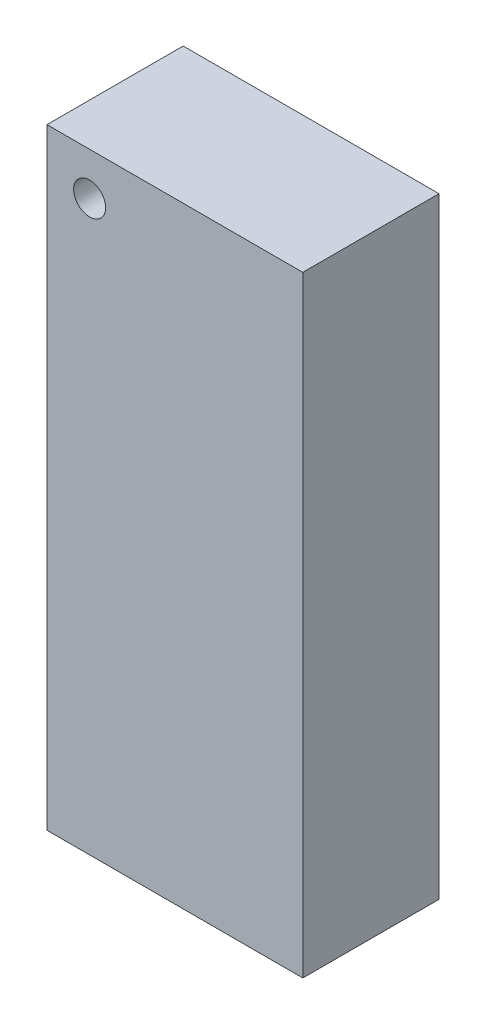
ISO-10303-21;
HEADER;
FILE_DESCRIPTION(('STEP AP214'),'2;1');
FILE_NAME('part.step','',(''),(''),'','','');
FILE_SCHEMA(('AUTOMOTIVE_DESIGN { 1 0 10303 214 1 1 1 1 }'));
ENDSEC;
DATA;
#1=APPLICATION_CONTEXT('core data for automotive mechanical design processes');
#2=APPLICATION_PROTOCOL_DEFINITION('international standard','automotive_design',2000,#1);
#3=PRODUCT_CONTEXT('',#1,'mechanical');
#4=PRODUCT('Part','Part','',(#3));
#5=PRODUCT_RELATED_PRODUCT_CATEGORY('part','',(#4));
#6=PRODUCT_DEFINITION_FORMATION('','',#4);
#7=PRODUCT_DEFINITION_CONTEXT('part definition',#1,'design');
#8=PRODUCT_DEFINITION('design','',#6,#7);
#9=PRODUCT_DEFINITION_SHAPE('','',#8);
#10=(LENGTH_UNIT() NAMED_UNIT(*) SI_UNIT(.MILLI.,.METRE.));
#11=(NAMED_UNIT(*) PLANE_ANGLE_UNIT() SI_UNIT($,.RADIAN.));
#12=(NAMED_UNIT(*) SI_UNIT($,.STERADIAN.) SOLID_ANGLE_UNIT());
#13=UNCERTAINTY_MEASURE_WITH_UNIT(LENGTH_MEASURE(1.E-05),#10,'distance_accuracy_value','');
#14=(GEOMETRIC_REPRESENTATION_CONTEXT(3) GLOBAL_UNCERTAINTY_ASSIGNED_CONTEXT((#13)) GLOBAL_UNIT_ASSIGNED_CONTEXT((#10,
#11,#12)) REPRESENTATION_CONTEXT('',''));
#15=CARTESIAN_POINT('',(0.,0.,0.));
#16=DIRECTION('',(0.,0.,1.));
#17=DIRECTION('',(1.,0.,0.));
#18=AXIS2_PLACEMENT_3D('',#15,#16,#17);
#19=CARTESIAN_POINT('',(0.18,2.4,0.505));
#20=DIRECTION('',(0.,0.,1.));
#21=DIRECTION('',(1.,0.,0.));
#22=AXIS2_PLACEMENT_3D('',#19,#20,#21);
#23=PLANE('',#22);
#24=CARTESIAN_POINT('',(0.18,2.4,0.505));
#25=DIRECTION('',(0.,0.,1.));
#26=DIRECTION('',(1.,0.,0.));
#27=AXIS2_PLACEMENT_3D('',#24,#25,#26);
#28=CIRCLE('',#27,0.0675);
#29=CARTESIAN_POINT('',(0.2475,2.4,0.505));
#30=VERTEX_POINT('',#29);
#31=EDGE_CURVE('E20',#30,#30,#28,.T.);
#32=ORIENTED_EDGE('',*,*,#31,.T.);
#33=EDGE_LOOP('',(#32));
#34=FACE_BOUND('',#33,.T.);
#35=ADVANCED_FACE('F17',(#34),#23,.T.);
#36=CARTESIAN_POINT('',(0.18,2.4,0.505));
#37=DIRECTION('',(0.,0.,1.));
#38=DIRECTION('',(1.,0.,0.));
#39=AXIS2_PLACEMENT_3D('',#36,#37,#38);
#40=CYLINDRICAL_SURFACE('',#39,0.0675);
#41=CARTESIAN_POINT('',(0.18,2.4,0.605));
#42=DIRECTION('',(0.,0.,1.));
#43=DIRECTION('',(1.,0.,0.));
#44=AXIS2_PLACEMENT_3D('',#41,#42,#43);
#45=CIRCLE('',#44,0.0675);
#46=CARTESIAN_POINT('',(0.2475,2.4,0.605));
#47=VERTEX_POINT('',#46);
#48=EDGE_CURVE('E66',#47,#47,#45,.F.);
#49=ORIENTED_EDGE('',*,*,#48,.F.);
#50=EDGE_LOOP('',(#49));
#51=FACE_BOUND('',#50,.T.);
#52=ORIENTED_EDGE('',*,*,#31,.F.);
#53=EDGE_LOOP('',(#52));
#54=FACE_BOUND('',#53,.T.);
#55=ADVANCED_FACE('F85',(#51,#54),#40,.F.);
#56=CARTESIAN_POINT('',(0.,0.,0.605));
#57=DIRECTION('',(0.,0.,1.));
#58=DIRECTION('',(1.,0.,0.));
#59=AXIS2_PLACEMENT_3D('',#56,#57,#58);
#60=PLANE('',#59);
#61=ORIENTED_EDGE('',*,*,#48,.T.);
#62=EDGE_LOOP('',(#61));
#63=FACE_BOUND('',#62,.T.);
#64=DIRECTION('',(0.,1.,0.));
#65=VECTOR('',#64,1.);
#66=CARTESIAN_POINT('',(1.08,0.,0.605));
#67=LINE('',#66,#65);
#68=CARTESIAN_POINT('',(1.08,2.58,0.605));
#69=VERTEX_POINT('',#68);
#70=CARTESIAN_POINT('',(1.08,0.,0.605));
#71=VERTEX_POINT('',#70);
#72=EDGE_CURVE('E167',#69,#71,#67,.F.);
#73=ORIENTED_EDGE('',*,*,#72,.F.);
#74=DIRECTION('',(1.,0.,0.));
#75=VECTOR('',#74,1.);
#76=CARTESIAN_POINT('',(0.,2.58,0.605));
#77=LINE('',#76,#75);
#78=CARTESIAN_POINT('',(0.,2.58,0.605));
#79=VERTEX_POINT('',#78);
#80=EDGE_CURVE('E60',#69,#79,#77,.F.);
#81=ORIENTED_EDGE('',*,*,#80,.T.);
#82=DIRECTION('',(0.,1.,0.));
#83=VECTOR('',#82,1.);
#84=CARTESIAN_POINT('',(0.,0.,0.605));
#85=LINE('',#84,#83);
#86=CARTESIAN_POINT('',(0.,0.,0.605));
#87=VERTEX_POINT('',#86);
#88=EDGE_CURVE('E58',#79,#87,#85,.F.);
#89=ORIENTED_EDGE('',*,*,#88,.T.);
#90=DIRECTION('',(1.,0.,0.));
#91=VECTOR('',#90,1.);
#92=CARTESIAN_POINT('',(0.,0.,0.605));
#93=LINE('',#92,#91);
#94=EDGE_CURVE('E55',#87,#71,#93,.T.);
#95=ORIENTED_EDGE('',*,*,#94,.T.);
#96=EDGE_LOOP('',(#73,#81,#89,#95));
#97=FACE_BOUND('',#96,.T.);
#98=ADVANCED_FACE('F59',(#63,#97),#60,.T.);
#99=CARTESIAN_POINT('',(0.,0.,0.03));
#100=DIRECTION('',(1.,0.,0.));
#101=DIRECTION('',(0.,0.,-1.));
#102=AXIS2_PLACEMENT_3D('',#99,#100,#101);
#103=PLANE('',#102);
#104=DIRECTION('',(0.,0.,1.));
#105=VECTOR('',#104,1.);
#106=CARTESIAN_POINT('',(0.,2.58,0.03));
#107=LINE('',#106,#105);
#108=CARTESIAN_POINT('',(0.,2.58,0.03));
#109=VERTEX_POINT('',#108);
#110=EDGE_CURVE('E168',#109,#79,#107,.T.);
#111=ORIENTED_EDGE('',*,*,#110,.F.);
#112=DIRECTION('',(0.,1.,0.));
#113=VECTOR('',#112,1.);
#114=CARTESIAN_POINT('',(0.,0.,0.03));
#115=LINE('',#114,#113);
#116=CARTESIAN_POINT('',(0.,0.,0.03));
#117=VERTEX_POINT('',#116);
#118=EDGE_CURVE('E77',#109,#117,#115,.F.);
#119=ORIENTED_EDGE('',*,*,#118,.T.);
#120=DIRECTION('',(0.,0.,1.));
#121=VECTOR('',#120,1.);
#122=CARTESIAN_POINT('',(0.,0.,0.03));
#123=LINE('',#122,#121);
#124=EDGE_CURVE('E65',#117,#87,#123,.T.);
#125=ORIENTED_EDGE('',*,*,#124,.T.);
#126=ORIENTED_EDGE('',*,*,#88,.F.);
#127=EDGE_LOOP('',(#111,#119,#125,#126));
#128=FACE_BOUND('',#127,.T.);
#129=ADVANCED_FACE('F76',(#128),#103,.F.);
#130=CARTESIAN_POINT('',(0.,0.,0.03));
#131=DIRECTION('',(0.,1.,0.));
#132=DIRECTION('',(0.,0.,1.));
#133=AXIS2_PLACEMENT_3D('',#130,#131,#132);
#134=PLANE('',#133);
#135=ORIENTED_EDGE('',*,*,#94,.F.);
#136=ORIENTED_EDGE('',*,*,#124,.F.);
#137=DIRECTION('',(1.,0.,0.));
#138=VECTOR('',#137,1.);
#139=CARTESIAN_POINT('',(0.,0.,0.03));
#140=LINE('',#139,#138);
#141=CARTESIAN_POINT('',(1.08,0.,0.03));
#142=VERTEX_POINT('',#141);
#143=EDGE_CURVE('E170',#117,#142,#140,.T.);
#144=ORIENTED_EDGE('',*,*,#143,.T.);
#145=DIRECTION('',(0.,0.,-1.));
#146=VECTOR('',#145,1.);
#147=CARTESIAN_POINT('',(1.08,0.,0.03));
#148=LINE('',#147,#146);
#149=EDGE_CURVE('E73',#71,#142,#148,.T.);
#150=ORIENTED_EDGE('',*,*,#149,.F.);
#151=EDGE_LOOP('',(#135,#136,#144,#150));
#152=FACE_BOUND('',#151,.T.);
#153=ADVANCED_FACE('F70',(#152),#134,.F.);
#154=CARTESIAN_POINT('',(1.08,0.,0.03));
#155=DIRECTION('',(1.,0.,0.));
#156=DIRECTION('',(0.,0.,-1.));
#157=AXIS2_PLACEMENT_3D('',#154,#155,#156);
#158=PLANE('',#157);
#159=DIRECTION('',(0.,0.,1.));
#160=VECTOR('',#159,1.);
#161=CARTESIAN_POINT('',(1.08,2.58,0.03));
#162=LINE('',#161,#160);
#163=CARTESIAN_POINT('',(1.08,2.58,0.03));
#164=VERTEX_POINT('',#163);
#165=EDGE_CURVE('E34',#69,#164,#162,.F.);
#166=ORIENTED_EDGE('',*,*,#165,.F.);
#167=ORIENTED_EDGE('',*,*,#72,.T.);
#168=ORIENTED_EDGE('',*,*,#149,.T.);
#169=DIRECTION('',(0.,1.,0.));
#170=VECTOR('',#169,1.);
#171=CARTESIAN_POINT('',(1.08,0.,0.03));
#172=LINE('',#171,#170);
#173=EDGE_CURVE('E26',#142,#164,#172,.T.);
#174=ORIENTED_EDGE('',*,*,#173,.T.);
#175=EDGE_LOOP('',(#166,#167,#168,#174));
#176=FACE_BOUND('',#175,.T.);
#177=ADVANCED_FACE('F103',(#176),#158,.T.);
#178=CARTESIAN_POINT('',(0.,2.58,0.03));
#179=DIRECTION('',(0.,1.,0.));
#180=DIRECTION('',(0.,0.,1.));
#181=AXIS2_PLACEMENT_3D('',#178,#179,#180);
#182=PLANE('',#181);
#183=ORIENTED_EDGE('',*,*,#80,.F.);
#184=ORIENTED_EDGE('',*,*,#165,.T.);
#185=DIRECTION('',(1.,0.,0.));
#186=VECTOR('',#185,1.);
#187=CARTESIAN_POINT('',(0.,2.58,0.03));
#188=LINE('',#187,#186);
#189=EDGE_CURVE('E11',#164,#109,#188,.F.);
#190=ORIENTED_EDGE('',*,*,#189,.T.);
#191=ORIENTED_EDGE('',*,*,#110,.T.);
#192=EDGE_LOOP('',(#183,#184,#190,#191));
#193=FACE_BOUND('',#192,.T.);
#194=ADVANCED_FACE('F97',(#193),#182,.T.);
#195=CARTESIAN_POINT('',(0.,0.,0.03));
#196=DIRECTION('',(0.,0.,1.));
#197=DIRECTION('',(1.,0.,0.));
#198=AXIS2_PLACEMENT_3D('',#195,#196,#197);
#199=PLANE('',#198);
#200=ORIENTED_EDGE('',*,*,#173,.F.);
#201=ORIENTED_EDGE('',*,*,#143,.F.);
#202=ORIENTED_EDGE('',*,*,#118,.F.);
#203=ORIENTED_EDGE('',*,*,#189,.F.);
#204=EDGE_LOOP('',(#200,#201,#202,#203));
#205=FACE_BOUND('',#204,.T.);
#206=ADVANCED_FACE('F95',(#205),#199,.F.);
#207=CLOSED_SHELL('',(#35,#55,#98,#129,#153,#177,#194,#206));
#208=MANIFOLD_SOLID_BREP('B1',#207);
#209=ADVANCED_BREP_SHAPE_REPRESENTATION('',(#18,#208),#14);
#210=SHAPE_DEFINITION_REPRESENTATION(#9,#209);
ENDSEC;
END-ISO-10303-21;
